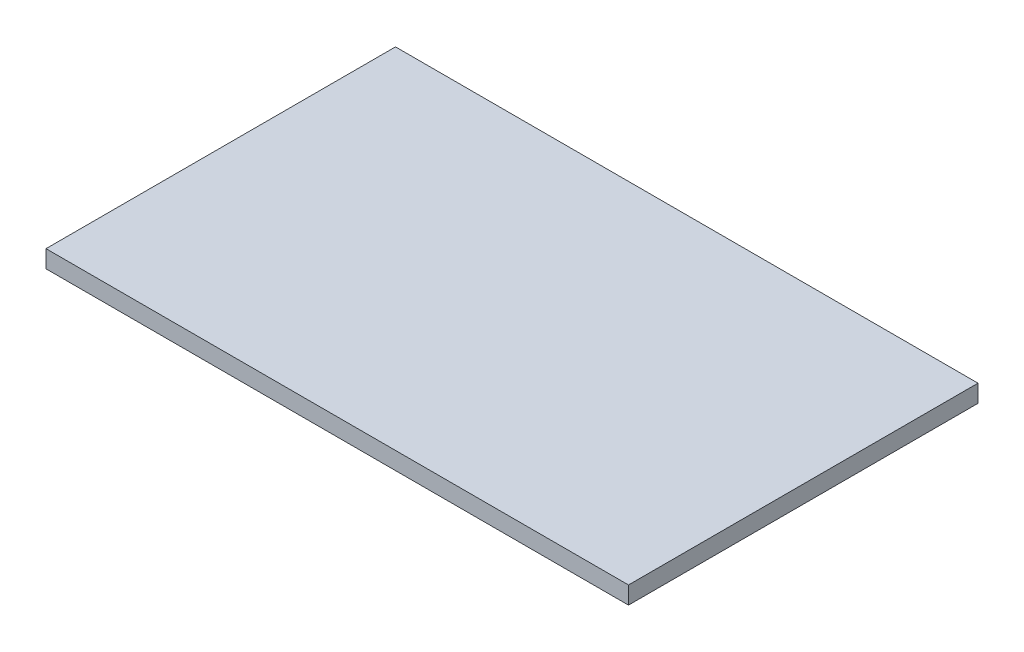
ISO-10303-21;
HEADER;
FILE_DESCRIPTION(('STEP AP214'),'2;1');
FILE_NAME('part.step','',(''),(''),'','','');
FILE_SCHEMA(('AUTOMOTIVE_DESIGN { 1 0 10303 214 1 1 1 1 }'));
ENDSEC;
DATA;
#1=APPLICATION_CONTEXT('core data for automotive mechanical design processes');
#2=APPLICATION_PROTOCOL_DEFINITION('international standard','automotive_design',2000,#1);
#3=PRODUCT_CONTEXT('',#1,'mechanical');
#4=PRODUCT('Part','Part','',(#3));
#5=PRODUCT_RELATED_PRODUCT_CATEGORY('part','',(#4));
#6=PRODUCT_DEFINITION_FORMATION('','',#4);
#7=PRODUCT_DEFINITION_CONTEXT('part definition',#1,'design');
#8=PRODUCT_DEFINITION('design','',#6,#7);
#9=PRODUCT_DEFINITION_SHAPE('','',#8);
#10=(LENGTH_UNIT() NAMED_UNIT(*) SI_UNIT(.MILLI.,.METRE.));
#11=(NAMED_UNIT(*) PLANE_ANGLE_UNIT() SI_UNIT($,.RADIAN.));
#12=(NAMED_UNIT(*) SI_UNIT($,.STERADIAN.) SOLID_ANGLE_UNIT());
#13=UNCERTAINTY_MEASURE_WITH_UNIT(LENGTH_MEASURE(1.E-05),#10,'distance_accuracy_value','');
#14=(GEOMETRIC_REPRESENTATION_CONTEXT(3) GLOBAL_UNCERTAINTY_ASSIGNED_CONTEXT((#13)) GLOBAL_UNIT_ASSIGNED_CONTEXT((#10,
#11,#12)) REPRESENTATION_CONTEXT('',''));
#15=CARTESIAN_POINT('',(0.,0.,0.));
#16=DIRECTION('',(0.,0.,1.));
#17=DIRECTION('',(1.,0.,0.));
#18=AXIS2_PLACEMENT_3D('',#15,#16,#17);
#19=CARTESIAN_POINT('',(0.,3.,0.));
#20=DIRECTION('',(1.,0.,0.));
#21=DIRECTION('',(0.,0.,-1.));
#22=AXIS2_PLACEMENT_3D('',#19,#20,#21);
#23=PLANE('',#22);
#24=DIRECTION('',(0.,0.,1.));
#25=VECTOR('',#24,1.);
#26=CARTESIAN_POINT('',(0.,0.,0.));
#27=LINE('',#26,#25);
#28=CARTESIAN_POINT('',(0.,0.,-60.));
#29=VERTEX_POINT('',#28);
#30=CARTESIAN_POINT('',(0.,0.,0.));
#31=VERTEX_POINT('',#30);
#32=EDGE_CURVE('E96',#29,#31,#27,.T.);
#33=ORIENTED_EDGE('',*,*,#32,.T.);
#34=DIRECTION('',(0.,-1.,0.));
#35=VECTOR('',#34,1.);
#36=CARTESIAN_POINT('',(0.,3.,0.));
#37=LINE('',#36,#35);
#38=CARTESIAN_POINT('',(0.,3.,0.));
#39=VERTEX_POINT('',#38);
#40=EDGE_CURVE('E11',#39,#31,#37,.T.);
#41=ORIENTED_EDGE('',*,*,#40,.F.);
#42=DIRECTION('',(0.,0.,1.));
#43=VECTOR('',#42,1.);
#44=CARTESIAN_POINT('',(0.,3.,0.));
#45=LINE('',#44,#43);
#46=CARTESIAN_POINT('',(0.,3.,-60.));
#47=VERTEX_POINT('',#46);
#48=EDGE_CURVE('E84',#47,#39,#45,.T.);
#49=ORIENTED_EDGE('',*,*,#48,.F.);
#50=DIRECTION('',(0.,-1.,0.));
#51=VECTOR('',#50,1.);
#52=CARTESIAN_POINT('',(0.,3.,-60.));
#53=LINE('',#52,#51);
#54=EDGE_CURVE('E92',#47,#29,#53,.T.);
#55=ORIENTED_EDGE('',*,*,#54,.T.);
#56=EDGE_LOOP('',(#33,#41,#49,#55));
#57=FACE_BOUND('',#56,.T.);
#58=ADVANCED_FACE('F33',(#57),#23,.F.);
#59=CARTESIAN_POINT('',(0.,3.,0.));
#60=DIRECTION('',(0.,0.,-1.));
#61=DIRECTION('',(-1.,0.,0.));
#62=AXIS2_PLACEMENT_3D('',#59,#60,#61);
#63=PLANE('',#62);
#64=DIRECTION('',(1.,0.,0.));
#65=VECTOR('',#64,1.);
#66=CARTESIAN_POINT('',(0.,0.,0.));
#67=LINE('',#66,#65);
#68=CARTESIAN_POINT('',(100.,0.,0.));
#69=VERTEX_POINT('',#68);
#70=EDGE_CURVE('E88',#31,#69,#67,.T.);
#71=ORIENTED_EDGE('',*,*,#70,.T.);
#72=DIRECTION('',(0.,-1.,0.));
#73=VECTOR('',#72,1.);
#74=CARTESIAN_POINT('',(100.,3.,0.));
#75=LINE('',#74,#73);
#76=CARTESIAN_POINT('',(100.,3.,0.));
#77=VERTEX_POINT('',#76);
#78=EDGE_CURVE('E41',#77,#69,#75,.T.);
#79=ORIENTED_EDGE('',*,*,#78,.F.);
#80=DIRECTION('',(1.,0.,0.));
#81=VECTOR('',#80,1.);
#82=CARTESIAN_POINT('',(0.,3.,0.));
#83=LINE('',#82,#81);
#84=EDGE_CURVE('E79',#39,#77,#83,.T.);
#85=ORIENTED_EDGE('',*,*,#84,.F.);
#86=ORIENTED_EDGE('',*,*,#40,.T.);
#87=EDGE_LOOP('',(#71,#79,#85,#86));
#88=FACE_BOUND('',#87,.T.);
#89=ADVANCED_FACE('F87',(#88),#63,.F.);
#90=CARTESIAN_POINT('',(100.,3.,0.));
#91=DIRECTION('',(-1.,0.,0.));
#92=DIRECTION('',(0.,0.,1.));
#93=AXIS2_PLACEMENT_3D('',#90,#91,#92);
#94=PLANE('',#93);
#95=DIRECTION('',(0.,0.,-1.));
#96=VECTOR('',#95,1.);
#97=CARTESIAN_POINT('',(100.,0.,0.));
#98=LINE('',#97,#96);
#99=CARTESIAN_POINT('',(100.,0.,-60.));
#100=VERTEX_POINT('',#99);
#101=EDGE_CURVE('E66',#69,#100,#98,.T.);
#102=ORIENTED_EDGE('',*,*,#101,.T.);
#103=DIRECTION('',(0.,-1.,0.));
#104=VECTOR('',#103,1.);
#105=CARTESIAN_POINT('',(100.,3.,-60.));
#106=LINE('',#105,#104);
#107=CARTESIAN_POINT('',(100.,3.,-60.));
#108=VERTEX_POINT('',#107);
#109=EDGE_CURVE('E89',#108,#100,#106,.T.);
#110=ORIENTED_EDGE('',*,*,#109,.F.);
#111=DIRECTION('',(0.,0.,-1.));
#112=VECTOR('',#111,1.);
#113=CARTESIAN_POINT('',(100.,3.,0.));
#114=LINE('',#113,#112);
#115=EDGE_CURVE('E82',#77,#108,#114,.T.);
#116=ORIENTED_EDGE('',*,*,#115,.F.);
#117=ORIENTED_EDGE('',*,*,#78,.T.);
#118=EDGE_LOOP('',(#102,#110,#116,#117));
#119=FACE_BOUND('',#118,.T.);
#120=ADVANCED_FACE('F90',(#119),#94,.F.);
#121=CARTESIAN_POINT('',(0.,3.,-60.));
#122=DIRECTION('',(0.,0.,1.));
#123=DIRECTION('',(1.,0.,0.));
#124=AXIS2_PLACEMENT_3D('',#121,#122,#123);
#125=PLANE('',#124);
#126=DIRECTION('',(-1.,0.,0.));
#127=VECTOR('',#126,1.);
#128=CARTESIAN_POINT('',(0.,0.,-60.));
#129=LINE('',#128,#127);
#130=EDGE_CURVE('E72',#100,#29,#129,.T.);
#131=ORIENTED_EDGE('',*,*,#130,.T.);
#132=ORIENTED_EDGE('',*,*,#54,.F.);
#133=DIRECTION('',(-1.,0.,0.));
#134=VECTOR('',#133,1.);
#135=CARTESIAN_POINT('',(0.,3.,-60.));
#136=LINE('',#135,#134);
#137=EDGE_CURVE('E49',#108,#47,#136,.T.);
#138=ORIENTED_EDGE('',*,*,#137,.F.);
#139=ORIENTED_EDGE('',*,*,#109,.T.);
#140=EDGE_LOOP('',(#131,#132,#138,#139));
#141=FACE_BOUND('',#140,.T.);
#142=ADVANCED_FACE('F103',(#141),#125,.F.);
#143=CARTESIAN_POINT('',(0.,3.,0.));
#144=DIRECTION('',(0.,-1.,0.));
#145=DIRECTION('',(0.,0.,-1.));
#146=AXIS2_PLACEMENT_3D('',#143,#144,#145);
#147=PLANE('',#146);
#148=ORIENTED_EDGE('',*,*,#48,.T.);
#149=ORIENTED_EDGE('',*,*,#84,.T.);
#150=ORIENTED_EDGE('',*,*,#115,.T.);
#151=ORIENTED_EDGE('',*,*,#137,.T.);
#152=EDGE_LOOP('',(#148,#149,#150,#151));
#153=FACE_BOUND('',#152,.T.);
#154=ADVANCED_FACE('F80',(#153),#147,.F.);
#155=CARTESIAN_POINT('',(0.,0.,0.));
#156=DIRECTION('',(0.,-1.,0.));
#157=DIRECTION('',(0.,0.,-1.));
#158=AXIS2_PLACEMENT_3D('',#155,#156,#157);
#159=PLANE('',#158);
#160=ORIENTED_EDGE('',*,*,#32,.F.);
#161=ORIENTED_EDGE('',*,*,#130,.F.);
#162=ORIENTED_EDGE('',*,*,#101,.F.);
#163=ORIENTED_EDGE('',*,*,#70,.F.);
#164=EDGE_LOOP('',(#160,#161,#162,#163));
#165=FACE_BOUND('',#164,.T.);
#166=ADVANCED_FACE('F106',(#165),#159,.T.);
#167=CLOSED_SHELL('',(#58,#89,#120,#142,#154,#166));
#168=MANIFOLD_SOLID_BREP('B2',#167);
#169=ADVANCED_BREP_SHAPE_REPRESENTATION('',(#18,#168),#14);
#170=SHAPE_DEFINITION_REPRESENTATION(#9,#169);
ENDSEC;
END-ISO-10303-21;
